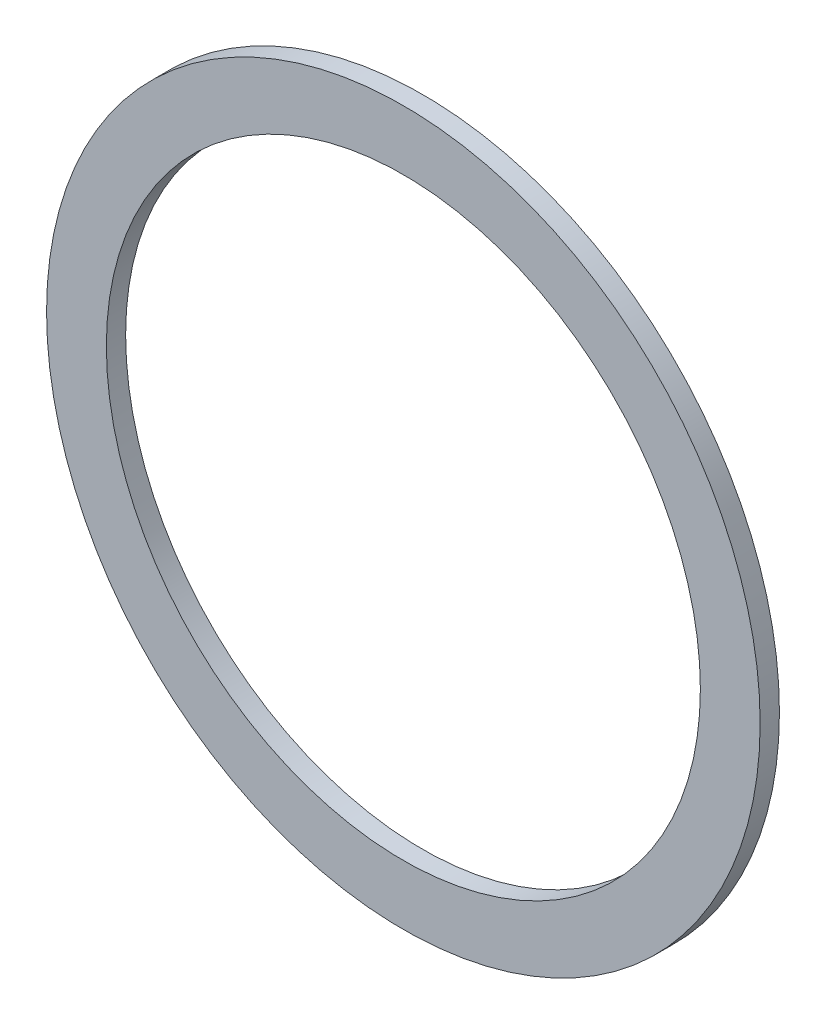
ISO-10303-21;
HEADER;
FILE_DESCRIPTION(('STEP AP214'),'2;1');
FILE_NAME('part.step','',(''),(''),'','','');
FILE_SCHEMA(('AUTOMOTIVE_DESIGN { 1 0 10303 214 1 1 1 1 }'));
ENDSEC;
DATA;
#1=APPLICATION_CONTEXT('core data for automotive mechanical design processes');
#2=APPLICATION_PROTOCOL_DEFINITION('international standard','automotive_design',2000,#1);
#3=PRODUCT_CONTEXT('',#1,'mechanical');
#4=PRODUCT('Part','Part','',(#3));
#5=PRODUCT_RELATED_PRODUCT_CATEGORY('part','',(#4));
#6=PRODUCT_DEFINITION_FORMATION('','',#4);
#7=PRODUCT_DEFINITION_CONTEXT('part definition',#1,'design');
#8=PRODUCT_DEFINITION('design','',#6,#7);
#9=PRODUCT_DEFINITION_SHAPE('','',#8);
#10=(LENGTH_UNIT() NAMED_UNIT(*) SI_UNIT(.MILLI.,.METRE.));
#11=(NAMED_UNIT(*) PLANE_ANGLE_UNIT() SI_UNIT($,.RADIAN.));
#12=(NAMED_UNIT(*) SI_UNIT($,.STERADIAN.) SOLID_ANGLE_UNIT());
#13=UNCERTAINTY_MEASURE_WITH_UNIT(LENGTH_MEASURE(1.E-05),#10,'distance_accuracy_value','');
#14=(GEOMETRIC_REPRESENTATION_CONTEXT(3) GLOBAL_UNCERTAINTY_ASSIGNED_CONTEXT((#13)) GLOBAL_UNIT_ASSIGNED_CONTEXT((#10,
#11,#12)) REPRESENTATION_CONTEXT('',''));
#15=CARTESIAN_POINT('',(0.,0.,0.));
#16=DIRECTION('',(0.,0.,1.));
#17=DIRECTION('',(1.,0.,0.));
#18=AXIS2_PLACEMENT_3D('',#15,#16,#17);
#19=CARTESIAN_POINT('',(0.,0.,22.5));
#20=DIRECTION('',(0.,0.,1.));
#21=DIRECTION('',(1.,0.,0.));
#22=AXIS2_PLACEMENT_3D('',#19,#20,#21);
#23=PLANE('',#22);
#24=CARTESIAN_POINT('',(0.,0.,22.5));
#25=DIRECTION('',(0.,0.,1.));
#26=DIRECTION('',(1.,0.,0.));
#27=AXIS2_PLACEMENT_3D('',#24,#25,#26);
#28=CIRCLE('',#27,18.5);
#29=CARTESIAN_POINT('',(18.5,0.,22.5));
#30=VERTEX_POINT('',#29);
#31=EDGE_CURVE('E10',#30,#30,#28,.T.);
#32=ORIENTED_EDGE('',*,*,#31,.T.);
#33=EDGE_LOOP('',(#32));
#34=FACE_BOUND('',#33,.T.);
#35=CARTESIAN_POINT('',(0.,0.,22.5));
#36=DIRECTION('',(0.,0.,1.));
#37=DIRECTION('',(1.,0.,0.));
#38=AXIS2_PLACEMENT_3D('',#35,#36,#37);
#39=CIRCLE('',#38,15.4);
#40=CARTESIAN_POINT('',(15.4,0.,22.5));
#41=VERTEX_POINT('',#40);
#42=EDGE_CURVE('E50',#41,#41,#39,.T.);
#43=ORIENTED_EDGE('',*,*,#42,.F.);
#44=EDGE_LOOP('',(#43));
#45=FACE_BOUND('',#44,.T.);
#46=ADVANCED_FACE('F36',(#34,#45),#23,.T.);
#47=CARTESIAN_POINT('',(0.,0.,21.5));
#48=DIRECTION('',(0.,0.,1.));
#49=DIRECTION('',(1.,0.,0.));
#50=AXIS2_PLACEMENT_3D('',#47,#48,#49);
#51=PLANE('',#50);
#52=CARTESIAN_POINT('',(0.,0.,21.5));
#53=DIRECTION('',(0.,0.,1.));
#54=DIRECTION('',(1.,0.,0.));
#55=AXIS2_PLACEMENT_3D('',#52,#53,#54);
#56=CIRCLE('',#55,18.5);
#57=CARTESIAN_POINT('',(18.5,0.,21.5));
#58=VERTEX_POINT('',#57);
#59=EDGE_CURVE('E40',#58,#58,#56,.T.);
#60=ORIENTED_EDGE('',*,*,#59,.F.);
#61=EDGE_LOOP('',(#60));
#62=FACE_BOUND('',#61,.T.);
#63=CARTESIAN_POINT('',(0.,0.,21.5));
#64=DIRECTION('',(0.,0.,1.));
#65=DIRECTION('',(1.,0.,0.));
#66=AXIS2_PLACEMENT_3D('',#63,#64,#65);
#67=CIRCLE('',#66,15.4);
#68=CARTESIAN_POINT('',(15.4,0.,21.5));
#69=VERTEX_POINT('',#68);
#70=EDGE_CURVE('E52',#69,#69,#67,.T.);
#71=ORIENTED_EDGE('',*,*,#70,.T.);
#72=EDGE_LOOP('',(#71));
#73=FACE_BOUND('',#72,.T.);
#74=ADVANCED_FACE('F63',(#62,#73),#51,.F.);
#75=CARTESIAN_POINT('',(0.,0.,22.5));
#76=DIRECTION('',(0.,0.,-1.));
#77=DIRECTION('',(-1.,0.,0.));
#78=AXIS2_PLACEMENT_3D('',#75,#76,#77);
#79=CYLINDRICAL_SURFACE('',#78,18.5);
#80=ORIENTED_EDGE('',*,*,#31,.F.);
#81=EDGE_LOOP('',(#80));
#82=FACE_BOUND('',#81,.T.);
#83=ORIENTED_EDGE('',*,*,#59,.T.);
#84=EDGE_LOOP('',(#83));
#85=FACE_BOUND('',#84,.T.);
#86=ADVANCED_FACE('F38',(#82,#85),#79,.T.);
#87=CARTESIAN_POINT('',(0.,0.,22.5));
#88=DIRECTION('',(0.,0.,-1.));
#89=DIRECTION('',(-1.,0.,0.));
#90=AXIS2_PLACEMENT_3D('',#87,#88,#89);
#91=CYLINDRICAL_SURFACE('',#90,15.4);
#92=ORIENTED_EDGE('',*,*,#42,.T.);
#93=EDGE_LOOP('',(#92));
#94=FACE_BOUND('',#93,.T.);
#95=ORIENTED_EDGE('',*,*,#70,.F.);
#96=EDGE_LOOP('',(#95));
#97=FACE_BOUND('',#96,.T.);
#98=ADVANCED_FACE('F59',(#94,#97),#91,.F.);
#99=CLOSED_SHELL('',(#46,#74,#86,#98));
#100=MANIFOLD_SOLID_BREP('B2',#99);
#101=ADVANCED_BREP_SHAPE_REPRESENTATION('',(#18,#100),#14);
#102=SHAPE_DEFINITION_REPRESENTATION(#9,#101);
ENDSEC;
END-ISO-10303-21;
